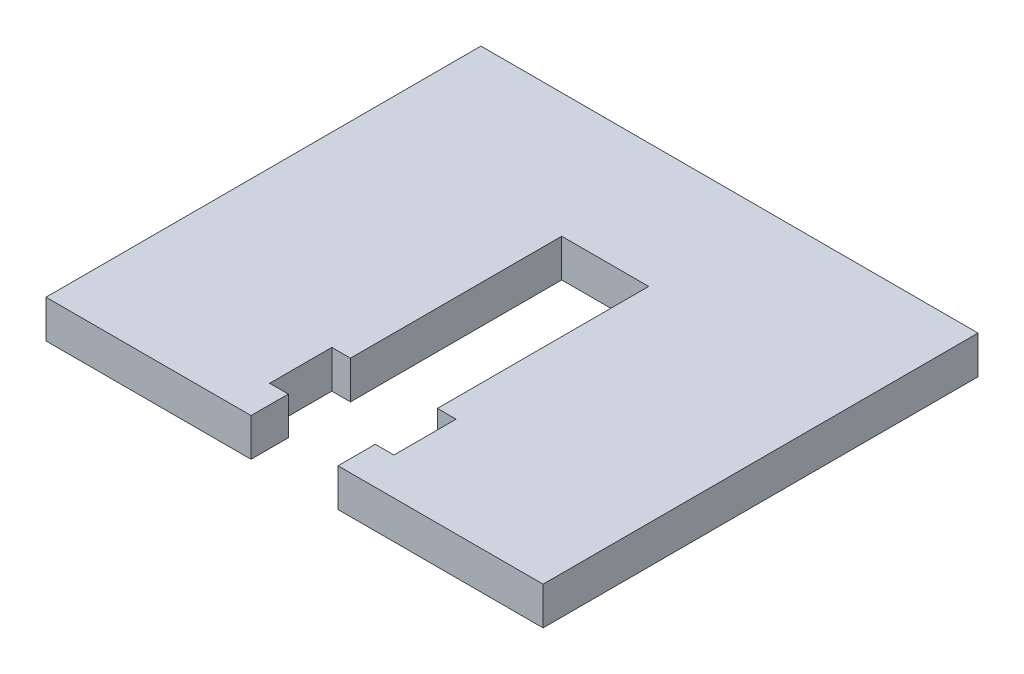
ISO-10303-21;
HEADER;
FILE_DESCRIPTION(('STEP AP214'),'2;1');
FILE_NAME('part.step','',(''),(''),'','','');
FILE_SCHEMA(('AUTOMOTIVE_DESIGN { 1 0 10303 214 1 1 1 1 }'));
ENDSEC;
DATA;
#1=APPLICATION_CONTEXT('core data for automotive mechanical design processes');
#2=APPLICATION_PROTOCOL_DEFINITION('international standard','automotive_design',2000,#1);
#3=PRODUCT_CONTEXT('',#1,'mechanical');
#4=PRODUCT('Part','Part','',(#3));
#5=PRODUCT_RELATED_PRODUCT_CATEGORY('part','',(#4));
#6=PRODUCT_DEFINITION_FORMATION('','',#4);
#7=PRODUCT_DEFINITION_CONTEXT('part definition',#1,'design');
#8=PRODUCT_DEFINITION('design','',#6,#7);
#9=PRODUCT_DEFINITION_SHAPE('','',#8);
#10=(LENGTH_UNIT() NAMED_UNIT(*) SI_UNIT(.MILLI.,.METRE.));
#11=(NAMED_UNIT(*) PLANE_ANGLE_UNIT() SI_UNIT($,.RADIAN.));
#12=(NAMED_UNIT(*) SI_UNIT($,.STERADIAN.) SOLID_ANGLE_UNIT());
#13=UNCERTAINTY_MEASURE_WITH_UNIT(LENGTH_MEASURE(1.E-05),#10,'distance_accuracy_value','');
#14=(GEOMETRIC_REPRESENTATION_CONTEXT(3) GLOBAL_UNCERTAINTY_ASSIGNED_CONTEXT((#13)) GLOBAL_UNIT_ASSIGNED_CONTEXT((#10,
#11,#12)) REPRESENTATION_CONTEXT('',''));
#15=CARTESIAN_POINT('',(0.,0.,0.));
#16=DIRECTION('',(0.,0.,1.));
#17=DIRECTION('',(1.,0.,0.));
#18=AXIS2_PLACEMENT_3D('',#15,#16,#17);
#19=CARTESIAN_POINT('',(16.5,3.05,0.));
#20=DIRECTION('',(0.,0.,-1.));
#21=DIRECTION('',(-1.,0.,0.));
#22=AXIS2_PLACEMENT_3D('',#19,#20,#21);
#23=PLANE('',#22);
#24=DIRECTION('',(1.,0.,0.));
#25=VECTOR('',#24,1.);
#26=CARTESIAN_POINT('',(16.5,0.,0.));
#27=LINE('',#26,#25);
#28=CARTESIAN_POINT('',(0.,0.,0.));
#29=VERTEX_POINT('',#28);
#30=CARTESIAN_POINT('',(16.5,0.,0.));
#31=VERTEX_POINT('',#30);
#32=EDGE_CURVE('E192',#29,#31,#27,.T.);
#33=ORIENTED_EDGE('',*,*,#32,.T.);
#34=DIRECTION('',(0.,-1.,0.));
#35=VECTOR('',#34,1.);
#36=CARTESIAN_POINT('',(16.5,3.05,0.));
#37=LINE('',#36,#35);
#38=CARTESIAN_POINT('',(16.5,3.05,0.));
#39=VERTEX_POINT('',#38);
#40=EDGE_CURVE('E11',#39,#31,#37,.T.);
#41=ORIENTED_EDGE('',*,*,#40,.F.);
#42=DIRECTION('',(1.,0.,0.));
#43=VECTOR('',#42,1.);
#44=CARTESIAN_POINT('',(16.5,3.05,0.));
#45=LINE('',#44,#43);
#46=CARTESIAN_POINT('',(0.,3.05,0.));
#47=VERTEX_POINT('',#46);
#48=EDGE_CURVE('E238',#47,#39,#45,.T.);
#49=ORIENTED_EDGE('',*,*,#48,.F.);
#50=DIRECTION('',(0.,-1.,0.));
#51=VECTOR('',#50,1.);
#52=CARTESIAN_POINT('',(0.,3.05,0.));
#53=LINE('',#52,#51);
#54=EDGE_CURVE('E188',#47,#29,#53,.T.);
#55=ORIENTED_EDGE('',*,*,#54,.T.);
#56=EDGE_LOOP('',(#33,#41,#49,#55));
#57=FACE_BOUND('',#56,.T.);
#58=ADVANCED_FACE('F43',(#57),#23,.F.);
#59=CARTESIAN_POINT('',(16.5,3.05,-3.));
#60=DIRECTION('',(-1.,0.,0.));
#61=DIRECTION('',(0.,0.,1.));
#62=AXIS2_PLACEMENT_3D('',#59,#60,#61);
#63=PLANE('',#62);
#64=DIRECTION('',(0.,0.,-1.));
#65=VECTOR('',#64,1.);
#66=CARTESIAN_POINT('',(16.5,0.,-3.));
#67=LINE('',#66,#65);
#68=CARTESIAN_POINT('',(16.5,0.,-3.));
#69=VERTEX_POINT('',#68);
#70=EDGE_CURVE('E196',#31,#69,#67,.T.);
#71=ORIENTED_EDGE('',*,*,#70,.T.);
#72=DIRECTION('',(0.,-1.,0.));
#73=VECTOR('',#72,1.);
#74=CARTESIAN_POINT('',(16.5,3.05,-3.));
#75=LINE('',#74,#73);
#76=CARTESIAN_POINT('',(16.5,3.05,-3.));
#77=VERTEX_POINT('',#76);
#78=EDGE_CURVE('E52',#77,#69,#75,.T.);
#79=ORIENTED_EDGE('',*,*,#78,.F.);
#80=DIRECTION('',(0.,0.,-1.));
#81=VECTOR('',#80,1.);
#82=CARTESIAN_POINT('',(16.5,3.05,-3.));
#83=LINE('',#82,#81);
#84=EDGE_CURVE('E127',#39,#77,#83,.T.);
#85=ORIENTED_EDGE('',*,*,#84,.F.);
#86=ORIENTED_EDGE('',*,*,#40,.T.);
#87=EDGE_LOOP('',(#71,#79,#85,#86));
#88=FACE_BOUND('',#87,.T.);
#89=ADVANCED_FACE('F360',(#88),#63,.F.);
#90=CARTESIAN_POINT('',(15.,3.05,-3.));
#91=DIRECTION('',(0.,0.,1.));
#92=DIRECTION('',(1.,0.,0.));
#93=AXIS2_PLACEMENT_3D('',#90,#91,#92);
#94=PLANE('',#93);
#95=DIRECTION('',(-1.,0.,0.));
#96=VECTOR('',#95,1.);
#97=CARTESIAN_POINT('',(15.,0.,-3.));
#98=LINE('',#97,#96);
#99=CARTESIAN_POINT('',(15.,0.,-3.));
#100=VERTEX_POINT('',#99);
#101=EDGE_CURVE('E199',#69,#100,#98,.T.);
#102=ORIENTED_EDGE('',*,*,#101,.T.);
#103=DIRECTION('',(0.,-1.,0.));
#104=VECTOR('',#103,1.);
#105=CARTESIAN_POINT('',(15.,3.05,-3.));
#106=LINE('',#105,#104);
#107=CARTESIAN_POINT('',(15.,3.05,-3.));
#108=VERTEX_POINT('',#107);
#109=EDGE_CURVE('E281',#108,#100,#106,.T.);
#110=ORIENTED_EDGE('',*,*,#109,.F.);
#111=DIRECTION('',(-1.,0.,0.));
#112=VECTOR('',#111,1.);
#113=CARTESIAN_POINT('',(15.,3.05,-3.));
#114=LINE('',#113,#112);
#115=EDGE_CURVE('E291',#77,#108,#114,.T.);
#116=ORIENTED_EDGE('',*,*,#115,.F.);
#117=ORIENTED_EDGE('',*,*,#78,.T.);
#118=EDGE_LOOP('',(#102,#110,#116,#117));
#119=FACE_BOUND('',#118,.T.);
#120=ADVANCED_FACE('F289',(#119),#94,.F.);
#121=CARTESIAN_POINT('',(15.,3.05,-8.));
#122=DIRECTION('',(-1.,0.,0.));
#123=DIRECTION('',(0.,0.,1.));
#124=AXIS2_PLACEMENT_3D('',#121,#122,#123);
#125=PLANE('',#124);
#126=DIRECTION('',(0.,0.,-1.));
#127=VECTOR('',#126,1.);
#128=CARTESIAN_POINT('',(15.,0.,-8.));
#129=LINE('',#128,#127);
#130=CARTESIAN_POINT('',(15.,0.,-8.));
#131=VERTEX_POINT('',#130);
#132=EDGE_CURVE('E202',#100,#131,#129,.T.);
#133=ORIENTED_EDGE('',*,*,#132,.T.);
#134=DIRECTION('',(0.,-1.,0.));
#135=VECTOR('',#134,1.);
#136=CARTESIAN_POINT('',(15.,3.05,-8.));
#137=LINE('',#136,#135);
#138=CARTESIAN_POINT('',(15.,3.05,-8.));
#139=VERTEX_POINT('',#138);
#140=EDGE_CURVE('E277',#139,#131,#137,.T.);
#141=ORIENTED_EDGE('',*,*,#140,.F.);
#142=DIRECTION('',(0.,0.,-1.));
#143=VECTOR('',#142,1.);
#144=CARTESIAN_POINT('',(15.,3.05,-8.));
#145=LINE('',#144,#143);
#146=EDGE_CURVE('E310',#108,#139,#145,.T.);
#147=ORIENTED_EDGE('',*,*,#146,.F.);
#148=ORIENTED_EDGE('',*,*,#109,.T.);
#149=EDGE_LOOP('',(#133,#141,#147,#148));
#150=FACE_BOUND('',#149,.T.);
#151=ADVANCED_FACE('F300',(#150),#125,.F.);
#152=CARTESIAN_POINT('',(16.5,3.05,-8.));
#153=DIRECTION('',(0.,0.,-1.));
#154=DIRECTION('',(-1.,0.,0.));
#155=AXIS2_PLACEMENT_3D('',#152,#153,#154);
#156=PLANE('',#155);
#157=DIRECTION('',(1.,0.,0.));
#158=VECTOR('',#157,1.);
#159=CARTESIAN_POINT('',(16.5,0.,-8.));
#160=LINE('',#159,#158);
#161=CARTESIAN_POINT('',(16.5,0.,-8.));
#162=VERTEX_POINT('',#161);
#163=EDGE_CURVE('E205',#131,#162,#160,.T.);
#164=ORIENTED_EDGE('',*,*,#163,.T.);
#165=DIRECTION('',(0.,-1.,0.));
#166=VECTOR('',#165,1.);
#167=CARTESIAN_POINT('',(16.5,3.05,-8.));
#168=LINE('',#167,#166);
#169=CARTESIAN_POINT('',(16.5,3.05,-8.));
#170=VERTEX_POINT('',#169);
#171=EDGE_CURVE('E273',#170,#162,#168,.T.);
#172=ORIENTED_EDGE('',*,*,#171,.F.);
#173=DIRECTION('',(1.,0.,0.));
#174=VECTOR('',#173,1.);
#175=CARTESIAN_POINT('',(16.5,3.05,-8.));
#176=LINE('',#175,#174);
#177=EDGE_CURVE('E306',#139,#170,#176,.T.);
#178=ORIENTED_EDGE('',*,*,#177,.F.);
#179=ORIENTED_EDGE('',*,*,#140,.T.);
#180=EDGE_LOOP('',(#164,#172,#178,#179));
#181=FACE_BOUND('',#180,.T.);
#182=ADVANCED_FACE('F304',(#181),#156,.F.);
#183=CARTESIAN_POINT('',(16.5,3.05,-25.));
#184=DIRECTION('',(-1.,0.,0.));
#185=DIRECTION('',(0.,0.,1.));
#186=AXIS2_PLACEMENT_3D('',#183,#184,#185);
#187=PLANE('',#186);
#188=DIRECTION('',(0.,0.,-1.));
#189=VECTOR('',#188,1.);
#190=CARTESIAN_POINT('',(16.5,0.,-25.));
#191=LINE('',#190,#189);
#192=CARTESIAN_POINT('',(16.5,0.,-25.));
#193=VERTEX_POINT('',#192);
#194=EDGE_CURVE('E208',#162,#193,#191,.T.);
#195=ORIENTED_EDGE('',*,*,#194,.T.);
#196=DIRECTION('',(0.,-1.,0.));
#197=VECTOR('',#196,1.);
#198=CARTESIAN_POINT('',(16.5,3.05,-25.));
#199=LINE('',#198,#197);
#200=CARTESIAN_POINT('',(16.5,3.05,-25.));
#201=VERTEX_POINT('',#200);
#202=EDGE_CURVE('E269',#201,#193,#199,.T.);
#203=ORIENTED_EDGE('',*,*,#202,.F.);
#204=DIRECTION('',(0.,0.,-1.));
#205=VECTOR('',#204,1.);
#206=CARTESIAN_POINT('',(16.5,3.05,-25.));
#207=LINE('',#206,#205);
#208=EDGE_CURVE('E309',#170,#201,#207,.T.);
#209=ORIENTED_EDGE('',*,*,#208,.F.);
#210=ORIENTED_EDGE('',*,*,#171,.T.);
#211=EDGE_LOOP('',(#195,#203,#209,#210));
#212=FACE_BOUND('',#211,.T.);
#213=ADVANCED_FACE('F373',(#212),#187,.F.);
#214=CARTESIAN_POINT('',(23.5,3.05,-25.));
#215=DIRECTION('',(0.,0.,-1.));
#216=DIRECTION('',(-1.,0.,0.));
#217=AXIS2_PLACEMENT_3D('',#214,#215,#216);
#218=PLANE('',#217);
#219=DIRECTION('',(1.,0.,0.));
#220=VECTOR('',#219,1.);
#221=CARTESIAN_POINT('',(23.5,0.,-25.));
#222=LINE('',#221,#220);
#223=CARTESIAN_POINT('',(23.5,0.,-25.));
#224=VERTEX_POINT('',#223);
#225=EDGE_CURVE('E211',#193,#224,#222,.T.);
#226=ORIENTED_EDGE('',*,*,#225,.T.);
#227=DIRECTION('',(0.,-1.,0.));
#228=VECTOR('',#227,1.);
#229=CARTESIAN_POINT('',(23.5,3.05,-25.));
#230=LINE('',#229,#228);
#231=CARTESIAN_POINT('',(23.5,3.05,-25.));
#232=VERTEX_POINT('',#231);
#233=EDGE_CURVE('E265',#232,#224,#230,.T.);
#234=ORIENTED_EDGE('',*,*,#233,.F.);
#235=DIRECTION('',(1.,0.,0.));
#236=VECTOR('',#235,1.);
#237=CARTESIAN_POINT('',(23.5,3.05,-25.));
#238=LINE('',#237,#236);
#239=EDGE_CURVE('E314',#201,#232,#238,.T.);
#240=ORIENTED_EDGE('',*,*,#239,.F.);
#241=ORIENTED_EDGE('',*,*,#202,.T.);
#242=EDGE_LOOP('',(#226,#234,#240,#241));
#243=FACE_BOUND('',#242,.T.);
#244=ADVANCED_FACE('F376',(#243),#218,.F.);
#245=CARTESIAN_POINT('',(23.5,3.05,-8.00000000000001));
#246=DIRECTION('',(1.,0.,0.));
#247=DIRECTION('',(0.,0.,-1.));
#248=AXIS2_PLACEMENT_3D('',#245,#246,#247);
#249=PLANE('',#248);
#250=DIRECTION('',(0.,0.,1.));
#251=VECTOR('',#250,1.);
#252=CARTESIAN_POINT('',(23.5,0.,-8.00000000000001));
#253=LINE('',#252,#251);
#254=CARTESIAN_POINT('',(23.5,0.,-8.00000000000001));
#255=VERTEX_POINT('',#254);
#256=EDGE_CURVE('E214',#224,#255,#253,.T.);
#257=ORIENTED_EDGE('',*,*,#256,.T.);
#258=DIRECTION('',(0.,-1.,0.));
#259=VECTOR('',#258,1.);
#260=CARTESIAN_POINT('',(23.5,3.05,-8.00000000000001));
#261=LINE('',#260,#259);
#262=CARTESIAN_POINT('',(23.5,3.05,-8.00000000000001));
#263=VERTEX_POINT('',#262);
#264=EDGE_CURVE('E261',#263,#255,#261,.T.);
#265=ORIENTED_EDGE('',*,*,#264,.F.);
#266=DIRECTION('',(0.,0.,1.));
#267=VECTOR('',#266,1.);
#268=CARTESIAN_POINT('',(23.5,3.05,-8.00000000000001));
#269=LINE('',#268,#267);
#270=EDGE_CURVE('E321',#232,#263,#269,.T.);
#271=ORIENTED_EDGE('',*,*,#270,.F.);
#272=ORIENTED_EDGE('',*,*,#233,.T.);
#273=EDGE_LOOP('',(#257,#265,#271,#272));
#274=FACE_BOUND('',#273,.T.);
#275=ADVANCED_FACE('F380',(#274),#249,.F.);
#276=CARTESIAN_POINT('',(25.,3.05,-8.));
#277=DIRECTION('',(0.,0.,-1.));
#278=DIRECTION('',(-1.,0.,0.));
#279=AXIS2_PLACEMENT_3D('',#276,#277,#278);
#280=PLANE('',#279);
#281=DIRECTION('',(1.,0.,0.));
#282=VECTOR('',#281,1.);
#283=CARTESIAN_POINT('',(25.,0.,-8.));
#284=LINE('',#283,#282);
#285=CARTESIAN_POINT('',(25.,0.,-8.));
#286=VERTEX_POINT('',#285);
#287=EDGE_CURVE('E217',#255,#286,#284,.T.);
#288=ORIENTED_EDGE('',*,*,#287,.T.);
#289=DIRECTION('',(0.,-1.,0.));
#290=VECTOR('',#289,1.);
#291=CARTESIAN_POINT('',(25.,3.05,-8.));
#292=LINE('',#291,#290);
#293=CARTESIAN_POINT('',(25.,3.05,-8.));
#294=VERTEX_POINT('',#293);
#295=EDGE_CURVE('E257',#294,#286,#292,.T.);
#296=ORIENTED_EDGE('',*,*,#295,.F.);
#297=DIRECTION('',(1.,0.,0.));
#298=VECTOR('',#297,1.);
#299=CARTESIAN_POINT('',(25.,3.05,-8.));
#300=LINE('',#299,#298);
#301=EDGE_CURVE('E324',#263,#294,#300,.T.);
#302=ORIENTED_EDGE('',*,*,#301,.F.);
#303=ORIENTED_EDGE('',*,*,#264,.T.);
#304=EDGE_LOOP('',(#288,#296,#302,#303));
#305=FACE_BOUND('',#304,.T.);
#306=ADVANCED_FACE('F384',(#305),#280,.F.);
#307=CARTESIAN_POINT('',(25.,3.05,-3.));
#308=DIRECTION('',(1.,0.,0.));
#309=DIRECTION('',(0.,0.,-1.));
#310=AXIS2_PLACEMENT_3D('',#307,#308,#309);
#311=PLANE('',#310);
#312=DIRECTION('',(0.,0.,1.));
#313=VECTOR('',#312,1.);
#314=CARTESIAN_POINT('',(25.,0.,-3.));
#315=LINE('',#314,#313);
#316=CARTESIAN_POINT('',(25.,0.,-3.));
#317=VERTEX_POINT('',#316);
#318=EDGE_CURVE('E220',#286,#317,#315,.T.);
#319=ORIENTED_EDGE('',*,*,#318,.T.);
#320=DIRECTION('',(0.,-1.,0.));
#321=VECTOR('',#320,1.);
#322=CARTESIAN_POINT('',(25.,3.05,-3.));
#323=LINE('',#322,#321);
#324=CARTESIAN_POINT('',(25.,3.05,-3.));
#325=VERTEX_POINT('',#324);
#326=EDGE_CURVE('E253',#325,#317,#323,.T.);
#327=ORIENTED_EDGE('',*,*,#326,.F.);
#328=DIRECTION('',(0.,0.,1.));
#329=VECTOR('',#328,1.);
#330=CARTESIAN_POINT('',(25.,3.05,-3.));
#331=LINE('',#330,#329);
#332=EDGE_CURVE('E327',#294,#325,#331,.T.);
#333=ORIENTED_EDGE('',*,*,#332,.F.);
#334=ORIENTED_EDGE('',*,*,#295,.T.);
#335=EDGE_LOOP('',(#319,#327,#333,#334));
#336=FACE_BOUND('',#335,.T.);
#337=ADVANCED_FACE('F388',(#336),#311,.F.);
#338=CARTESIAN_POINT('',(23.5,3.05,-3.));
#339=DIRECTION('',(0.,0.,1.));
#340=DIRECTION('',(1.,0.,0.));
#341=AXIS2_PLACEMENT_3D('',#338,#339,#340);
#342=PLANE('',#341);
#343=DIRECTION('',(-1.,0.,0.));
#344=VECTOR('',#343,1.);
#345=CARTESIAN_POINT('',(23.5,0.,-3.));
#346=LINE('',#345,#344);
#347=CARTESIAN_POINT('',(23.5,0.,-3.));
#348=VERTEX_POINT('',#347);
#349=EDGE_CURVE('E223',#317,#348,#346,.T.);
#350=ORIENTED_EDGE('',*,*,#349,.T.);
#351=DIRECTION('',(0.,-1.,0.));
#352=VECTOR('',#351,1.);
#353=CARTESIAN_POINT('',(23.5,3.05,-3.));
#354=LINE('',#353,#352);
#355=CARTESIAN_POINT('',(23.5,3.05,-3.));
#356=VERTEX_POINT('',#355);
#357=EDGE_CURVE('E249',#356,#348,#354,.T.);
#358=ORIENTED_EDGE('',*,*,#357,.F.);
#359=DIRECTION('',(-1.,0.,0.));
#360=VECTOR('',#359,1.);
#361=CARTESIAN_POINT('',(23.5,3.05,-3.));
#362=LINE('',#361,#360);
#363=EDGE_CURVE('E330',#325,#356,#362,.T.);
#364=ORIENTED_EDGE('',*,*,#363,.F.);
#365=ORIENTED_EDGE('',*,*,#326,.T.);
#366=EDGE_LOOP('',(#350,#358,#364,#365));
#367=FACE_BOUND('',#366,.T.);
#368=ADVANCED_FACE('F392',(#367),#342,.F.);
#369=CARTESIAN_POINT('',(23.5,3.05,0.));
#370=DIRECTION('',(1.,0.,0.));
#371=DIRECTION('',(0.,0.,-1.));
#372=AXIS2_PLACEMENT_3D('',#369,#370,#371);
#373=PLANE('',#372);
#374=DIRECTION('',(0.,0.,1.));
#375=VECTOR('',#374,1.);
#376=CARTESIAN_POINT('',(23.5,0.,0.));
#377=LINE('',#376,#375);
#378=CARTESIAN_POINT('',(23.5,0.,0.));
#379=VERTEX_POINT('',#378);
#380=EDGE_CURVE('E226',#348,#379,#377,.T.);
#381=ORIENTED_EDGE('',*,*,#380,.T.);
#382=DIRECTION('',(0.,-1.,0.));
#383=VECTOR('',#382,1.);
#384=CARTESIAN_POINT('',(23.5,3.05,0.));
#385=LINE('',#384,#383);
#386=CARTESIAN_POINT('',(23.5,3.05,0.));
#387=VERTEX_POINT('',#386);
#388=EDGE_CURVE('E245',#387,#379,#385,.T.);
#389=ORIENTED_EDGE('',*,*,#388,.F.);
#390=DIRECTION('',(0.,0.,1.));
#391=VECTOR('',#390,1.);
#392=CARTESIAN_POINT('',(23.5,3.05,0.));
#393=LINE('',#392,#391);
#394=EDGE_CURVE('E333',#356,#387,#393,.T.);
#395=ORIENTED_EDGE('',*,*,#394,.F.);
#396=ORIENTED_EDGE('',*,*,#357,.T.);
#397=EDGE_LOOP('',(#381,#389,#395,#396));
#398=FACE_BOUND('',#397,.T.);
#399=ADVANCED_FACE('F341',(#398),#373,.F.);
#400=CARTESIAN_POINT('',(40.,3.05,0.));
#401=DIRECTION('',(0.,0.,-1.));
#402=DIRECTION('',(-1.,0.,0.));
#403=AXIS2_PLACEMENT_3D('',#400,#401,#402);
#404=PLANE('',#403);
#405=DIRECTION('',(1.,0.,0.));
#406=VECTOR('',#405,1.);
#407=CARTESIAN_POINT('',(40.,0.,0.));
#408=LINE('',#407,#406);
#409=CARTESIAN_POINT('',(40.,0.,0.));
#410=VERTEX_POINT('',#409);
#411=EDGE_CURVE('E229',#379,#410,#408,.T.);
#412=ORIENTED_EDGE('',*,*,#411,.T.);
#413=DIRECTION('',(0.,-1.,0.));
#414=VECTOR('',#413,1.);
#415=CARTESIAN_POINT('',(40.,3.05,0.));
#416=LINE('',#415,#414);
#417=CARTESIAN_POINT('',(40.,3.05,0.));
#418=VERTEX_POINT('',#417);
#419=EDGE_CURVE('E181',#418,#410,#416,.T.);
#420=ORIENTED_EDGE('',*,*,#419,.F.);
#421=DIRECTION('',(1.,0.,0.));
#422=VECTOR('',#421,1.);
#423=CARTESIAN_POINT('',(40.,3.05,0.));
#424=LINE('',#423,#422);
#425=EDGE_CURVE('E170',#387,#418,#424,.T.);
#426=ORIENTED_EDGE('',*,*,#425,.F.);
#427=ORIENTED_EDGE('',*,*,#388,.T.);
#428=EDGE_LOOP('',(#412,#420,#426,#427));
#429=FACE_BOUND('',#428,.T.);
#430=ADVANCED_FACE('F345',(#429),#404,.F.);
#431=CARTESIAN_POINT('',(40.,3.05,-35.));
#432=DIRECTION('',(-1.,0.,0.));
#433=DIRECTION('',(0.,0.,1.));
#434=AXIS2_PLACEMENT_3D('',#431,#432,#433);
#435=PLANE('',#434);
#436=DIRECTION('',(0.,0.,-1.));
#437=VECTOR('',#436,1.);
#438=CARTESIAN_POINT('',(40.,0.,-35.));
#439=LINE('',#438,#437);
#440=CARTESIAN_POINT('',(40.,0.,-35.));
#441=VERTEX_POINT('',#440);
#442=EDGE_CURVE('E179',#410,#441,#439,.T.);
#443=ORIENTED_EDGE('',*,*,#442,.T.);
#444=DIRECTION('',(0.,-1.,0.));
#445=VECTOR('',#444,1.);
#446=CARTESIAN_POINT('',(40.,3.05,-35.));
#447=LINE('',#446,#445);
#448=CARTESIAN_POINT('',(40.,3.05,-35.));
#449=VERTEX_POINT('',#448);
#450=EDGE_CURVE('E176',#449,#441,#447,.T.);
#451=ORIENTED_EDGE('',*,*,#450,.F.);
#452=DIRECTION('',(0.,0.,-1.));
#453=VECTOR('',#452,1.);
#454=CARTESIAN_POINT('',(40.,3.05,-35.));
#455=LINE('',#454,#453);
#456=EDGE_CURVE('E164',#418,#449,#455,.T.);
#457=ORIENTED_EDGE('',*,*,#456,.F.);
#458=ORIENTED_EDGE('',*,*,#419,.T.);
#459=EDGE_LOOP('',(#443,#451,#457,#458));
#460=FACE_BOUND('',#459,.T.);
#461=ADVANCED_FACE('F177',(#460),#435,.F.);
#462=CARTESIAN_POINT('',(0.,3.05,-35.));
#463=DIRECTION('',(0.,0.,1.));
#464=DIRECTION('',(1.,0.,0.));
#465=AXIS2_PLACEMENT_3D('',#462,#463,#464);
#466=PLANE('',#465);
#467=DIRECTION('',(-1.,0.,0.));
#468=VECTOR('',#467,1.);
#469=CARTESIAN_POINT('',(0.,0.,-35.));
#470=LINE('',#469,#468);
#471=CARTESIAN_POINT('',(0.,0.,-35.));
#472=VERTEX_POINT('',#471);
#473=EDGE_CURVE('E113',#441,#472,#470,.T.);
#474=ORIENTED_EDGE('',*,*,#473,.T.);
#475=DIRECTION('',(0.,-1.,0.));
#476=VECTOR('',#475,1.);
#477=CARTESIAN_POINT('',(0.,3.05,-35.));
#478=LINE('',#477,#476);
#479=CARTESIAN_POINT('',(0.,3.05,-35.));
#480=VERTEX_POINT('',#479);
#481=EDGE_CURVE('E182',#480,#472,#478,.T.);
#482=ORIENTED_EDGE('',*,*,#481,.F.);
#483=DIRECTION('',(-1.,0.,0.));
#484=VECTOR('',#483,1.);
#485=CARTESIAN_POINT('',(0.,3.05,-35.));
#486=LINE('',#485,#484);
#487=EDGE_CURVE('E168',#449,#480,#486,.T.);
#488=ORIENTED_EDGE('',*,*,#487,.F.);
#489=ORIENTED_EDGE('',*,*,#450,.T.);
#490=EDGE_LOOP('',(#474,#482,#488,#489));
#491=FACE_BOUND('',#490,.T.);
#492=ADVANCED_FACE('F184',(#491),#466,.F.);
#493=CARTESIAN_POINT('',(0.,3.05,0.));
#494=DIRECTION('',(1.,0.,0.));
#495=DIRECTION('',(0.,0.,-1.));
#496=AXIS2_PLACEMENT_3D('',#493,#494,#495);
#497=PLANE('',#496);
#498=DIRECTION('',(0.,0.,1.));
#499=VECTOR('',#498,1.);
#500=CARTESIAN_POINT('',(0.,0.,0.));
#501=LINE('',#500,#499);
#502=EDGE_CURVE('E119',#472,#29,#501,.T.);
#503=ORIENTED_EDGE('',*,*,#502,.T.);
#504=ORIENTED_EDGE('',*,*,#54,.F.);
#505=DIRECTION('',(0.,0.,1.));
#506=VECTOR('',#505,1.);
#507=CARTESIAN_POINT('',(0.,3.05,0.));
#508=LINE('',#507,#506);
#509=EDGE_CURVE('E60',#480,#47,#508,.T.);
#510=ORIENTED_EDGE('',*,*,#509,.F.);
#511=ORIENTED_EDGE('',*,*,#481,.T.);
#512=EDGE_LOOP('',(#503,#504,#510,#511));
#513=FACE_BOUND('',#512,.T.);
#514=ADVANCED_FACE('F349',(#513),#497,.F.);
#515=CARTESIAN_POINT('',(0.,3.05,0.));
#516=DIRECTION('',(0.,-1.,0.));
#517=DIRECTION('',(0.,0.,-1.));
#518=AXIS2_PLACEMENT_3D('',#515,#516,#517);
#519=PLANE('',#518);
#520=ORIENTED_EDGE('',*,*,#48,.T.);
#521=ORIENTED_EDGE('',*,*,#84,.T.);
#522=ORIENTED_EDGE('',*,*,#115,.T.);
#523=ORIENTED_EDGE('',*,*,#146,.T.);
#524=ORIENTED_EDGE('',*,*,#177,.T.);
#525=ORIENTED_EDGE('',*,*,#208,.T.);
#526=ORIENTED_EDGE('',*,*,#239,.T.);
#527=ORIENTED_EDGE('',*,*,#270,.T.);
#528=ORIENTED_EDGE('',*,*,#301,.T.);
#529=ORIENTED_EDGE('',*,*,#332,.T.);
#530=ORIENTED_EDGE('',*,*,#363,.T.);
#531=ORIENTED_EDGE('',*,*,#394,.T.);
#532=ORIENTED_EDGE('',*,*,#425,.T.);
#533=ORIENTED_EDGE('',*,*,#456,.T.);
#534=ORIENTED_EDGE('',*,*,#487,.T.);
#535=ORIENTED_EDGE('',*,*,#509,.T.);
#536=EDGE_LOOP('',(#520,#521,#522,#523,#524,#525,#526,#527,#528,#529,#530,#531,#532,#533,#534,#535));
#537=FACE_BOUND('',#536,.T.);
#538=ADVANCED_FACE('F166',(#537),#519,.F.);
#539=CARTESIAN_POINT('',(0.,0.,0.));
#540=DIRECTION('',(0.,-1.,0.));
#541=DIRECTION('',(0.,0.,-1.));
#542=AXIS2_PLACEMENT_3D('',#539,#540,#541);
#543=PLANE('',#542);
#544=ORIENTED_EDGE('',*,*,#32,.F.);
#545=ORIENTED_EDGE('',*,*,#502,.F.);
#546=ORIENTED_EDGE('',*,*,#473,.F.);
#547=ORIENTED_EDGE('',*,*,#442,.F.);
#548=ORIENTED_EDGE('',*,*,#411,.F.);
#549=ORIENTED_EDGE('',*,*,#380,.F.);
#550=ORIENTED_EDGE('',*,*,#349,.F.);
#551=ORIENTED_EDGE('',*,*,#318,.F.);
#552=ORIENTED_EDGE('',*,*,#287,.F.);
#553=ORIENTED_EDGE('',*,*,#256,.F.);
#554=ORIENTED_EDGE('',*,*,#225,.F.);
#555=ORIENTED_EDGE('',*,*,#194,.F.);
#556=ORIENTED_EDGE('',*,*,#163,.F.);
#557=ORIENTED_EDGE('',*,*,#132,.F.);
#558=ORIENTED_EDGE('',*,*,#101,.F.);
#559=ORIENTED_EDGE('',*,*,#70,.F.);
#560=EDGE_LOOP('',(#544,#545,#546,#547,#548,#549,#550,#551,#552,#553,#554,#555,#556,#557,#558,#559));
#561=FACE_BOUND('',#560,.T.);
#562=ADVANCED_FACE('F295',(#561),#543,.T.);
#563=CLOSED_SHELL('',(#58,#89,#120,#151,#182,#213,#244,#275,#306,#337,#368,#399,#430,#461,#492,
#514,#538,#562));
#564=MANIFOLD_SOLID_BREP('B2',#563);
#565=ADVANCED_BREP_SHAPE_REPRESENTATION('',(#18,#564),#14);
#566=SHAPE_DEFINITION_REPRESENTATION(#9,#565);
ENDSEC;
END-ISO-10303-21;
